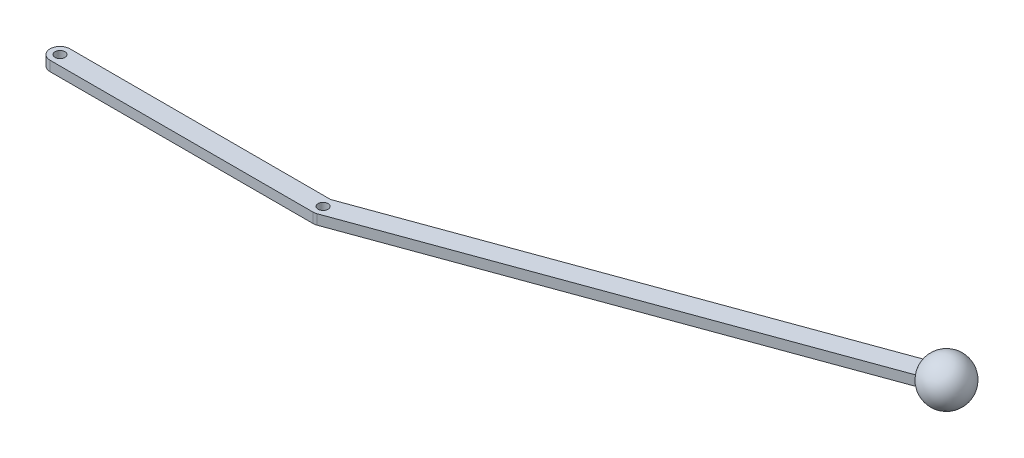
ISO-10303-21;
HEADER;
FILE_DESCRIPTION(('STEP AP214'),'2;1');
FILE_NAME('part.step','',(''),(''),'','','');
FILE_SCHEMA(('AUTOMOTIVE_DESIGN { 1 0 10303 214 1 1 1 1 }'));
ENDSEC;
DATA;
#1=APPLICATION_CONTEXT('core data for automotive mechanical design processes');
#2=APPLICATION_PROTOCOL_DEFINITION('international standard','automotive_design',2000,#1);
#3=PRODUCT_CONTEXT('',#1,'mechanical');
#4=PRODUCT('Part','Part','',(#3));
#5=PRODUCT_RELATED_PRODUCT_CATEGORY('part','',(#4));
#6=PRODUCT_DEFINITION_FORMATION('','',#4);
#7=PRODUCT_DEFINITION_CONTEXT('part definition',#1,'design');
#8=PRODUCT_DEFINITION('design','',#6,#7);
#9=PRODUCT_DEFINITION_SHAPE('','',#8);
#10=(LENGTH_UNIT() NAMED_UNIT(*) SI_UNIT(.MILLI.,.METRE.));
#11=(NAMED_UNIT(*) PLANE_ANGLE_UNIT() SI_UNIT($,.RADIAN.));
#12=(NAMED_UNIT(*) SI_UNIT($,.STERADIAN.) SOLID_ANGLE_UNIT());
#13=UNCERTAINTY_MEASURE_WITH_UNIT(LENGTH_MEASURE(1.E-05),#10,'distance_accuracy_value','');
#14=(GEOMETRIC_REPRESENTATION_CONTEXT(3) GLOBAL_UNCERTAINTY_ASSIGNED_CONTEXT((#13)) GLOBAL_UNIT_ASSIGNED_CONTEXT((#10,
#11,#12)) REPRESENTATION_CONTEXT('',''));
#15=CARTESIAN_POINT('',(0.,0.,0.));
#16=DIRECTION('',(0.,0.,1.));
#17=DIRECTION('',(1.,0.,0.));
#18=AXIS2_PLACEMENT_3D('',#15,#16,#17);
#19=CARTESIAN_POINT('',(0.,5.,0.));
#20=DIRECTION('',(0.,-1.,0.));
#21=DIRECTION('',(0.,0.,-1.));
#22=AXIS2_PLACEMENT_3D('',#19,#20,#21);
#23=CYLINDRICAL_SURFACE('',#22,10.);
#24=CARTESIAN_POINT('',(0.,-5.,0.));
#25=DIRECTION('',(0.,1.,0.));
#26=DIRECTION('',(0.,0.,1.));
#27=AXIS2_PLACEMENT_3D('',#24,#25,#26);
#28=CIRCLE('',#27,10.);
#29=CARTESIAN_POINT('',(3.42020143325664,-5.,9.39692620785914));
#30=VERTEX_POINT('',#29);
#31=CARTESIAN_POINT('',(1.45283093859922E-13,-5.,10.));
#32=VERTEX_POINT('',#31);
#33=EDGE_CURVE('E164',#30,#32,#28,.F.);
#34=ORIENTED_EDGE('',*,*,#33,.F.);
#35=DIRECTION('',(0.,-1.,0.));
#36=VECTOR('',#35,1.);
#37=CARTESIAN_POINT('',(3.42020143325664,5.,9.39692620785914));
#38=LINE('',#37,#36);
#39=CARTESIAN_POINT('',(3.42020143325664,5.,9.39692620785914));
#40=VERTEX_POINT('',#39);
#41=EDGE_CURVE('E48',#40,#30,#38,.T.);
#42=ORIENTED_EDGE('',*,*,#41,.F.);
#43=CARTESIAN_POINT('',(0.,5.,0.));
#44=DIRECTION('',(0.,1.,0.));
#45=DIRECTION('',(0.,0.,1.));
#46=AXIS2_PLACEMENT_3D('',#43,#44,#45);
#47=CIRCLE('',#46,10.);
#48=CARTESIAN_POINT('',(1.45283093859922E-13,5.,10.));
#49=VERTEX_POINT('',#48);
#50=EDGE_CURVE('E135',#40,#49,#47,.F.);
#51=ORIENTED_EDGE('',*,*,#50,.T.);
#52=DIRECTION('',(0.,-1.,0.));
#53=VECTOR('',#52,1.);
#54=CARTESIAN_POINT('',(1.45283093859922E-13,5.,10.));
#55=LINE('',#54,#53);
#56=EDGE_CURVE('E156',#49,#32,#55,.T.);
#57=ORIENTED_EDGE('',*,*,#56,.T.);
#58=EDGE_LOOP('',(#34,#42,#51,#57));
#59=FACE_BOUND('',#58,.T.);
#60=ADVANCED_FACE('F39',(#59),#23,.T.);
#61=CARTESIAN_POINT('',(3.42020143325671,5.,9.39692620785912));
#62=DIRECTION('',(0.34202014332567,0.,0.939692620785908));
#63=DIRECTION('',(0.939692620785908,0.,-0.34202014332567));
#64=AXIS2_PLACEMENT_3D('',#61,#62,#63);
#65=PLANE('',#64);
#66=DIRECTION('',(-0.939692620785908,0.,0.34202014332567));
#67=VECTOR('',#66,1.);
#68=CARTESIAN_POINT('',(3.42020143325671,-5.,9.39692620785912));
#69=LINE('',#68,#67);
#70=CARTESIAN_POINT('',(445.521500650989,-5.,-151.514787237812));
#71=VERTEX_POINT('',#70);
#72=EDGE_CURVE('E110',#71,#30,#69,.T.);
#73=ORIENTED_EDGE('',*,*,#72,.F.);
#74=CARTESIAN_POINT('',(463.869585618352,0.,-158.192944021719));
#75=DIRECTION('',(0.34202014332567,0.,0.939692620785908));
#76=DIRECTION('',(0.939692620785908,0.,-0.34202014332567));
#77=AXIS2_PLACEMENT_3D('',#74,#75,#76);
#78=CIRCLE('',#77,20.1556443707464);
#79=CARTESIAN_POINT('',(445.521500650989,5.,-151.514787237812));
#80=VERTEX_POINT('',#79);
#81=EDGE_CURVE('E63',#71,#80,#78,.F.);
#82=ORIENTED_EDGE('',*,*,#81,.T.);
#83=DIRECTION('',(-0.939692620785908,0.,0.34202014332567));
#84=VECTOR('',#83,1.);
#85=CARTESIAN_POINT('',(3.42020143325671,5.,9.39692620785912));
#86=LINE('',#85,#84);
#87=EDGE_CURVE('E139',#80,#40,#86,.T.);
#88=ORIENTED_EDGE('',*,*,#87,.T.);
#89=ORIENTED_EDGE('',*,*,#41,.T.);
#90=EDGE_LOOP('',(#73,#82,#88,#89));
#91=FACE_BOUND('',#90,.T.);
#92=ADVANCED_FACE('F192',(#91),#65,.T.);
#93=CARTESIAN_POINT('',(-3.42020143325664,5.,-9.39692620785891));
#94=DIRECTION('',(-0.34202014332567,0.,-0.939692620785908));
#95=DIRECTION('',(-0.939692620785908,0.,0.34202014332567));
#96=AXIS2_PLACEMENT_3D('',#93,#94,#95);
#97=PLANE('',#96);
#98=DIRECTION('',(0.939692620785908,0.,-0.34202014332567));
#99=VECTOR('',#98,1.);
#100=CARTESIAN_POINT('',(-3.42020143325664,5.,-9.39692620785891));
#101=LINE('',#100,#99);
#102=CARTESIAN_POINT('',(-2.2245441287731,5.,-9.83210987707389));
#103=VERTEX_POINT('',#102);
#104=CARTESIAN_POINT('',(438.681097784476,5.,-170.30863965353));
#105=VERTEX_POINT('',#104);
#106=EDGE_CURVE('E115',#103,#105,#101,.T.);
#107=ORIENTED_EDGE('',*,*,#106,.T.);
#108=CARTESIAN_POINT('',(457.029182751838,0.,-176.986796437437));
#109=DIRECTION('',(-0.34202014332567,0.,-0.939692620785908));
#110=DIRECTION('',(-0.939692620785908,0.,0.34202014332567));
#111=AXIS2_PLACEMENT_3D('',#108,#109,#110);
#112=CIRCLE('',#111,20.1556443707464);
#113=CARTESIAN_POINT('',(438.681097784476,-5.,-170.30863965353));
#114=VERTEX_POINT('',#113);
#115=EDGE_CURVE('E113',#105,#114,#112,.F.);
#116=ORIENTED_EDGE('',*,*,#115,.T.);
#117=DIRECTION('',(0.939692620785908,0.,-0.34202014332567));
#118=VECTOR('',#117,1.);
#119=CARTESIAN_POINT('',(-3.42020143325664,-5.,-9.39692620785891));
#120=LINE('',#119,#118);
#121=CARTESIAN_POINT('',(-2.2245441287731,-5.,-9.83210987707389));
#122=VERTEX_POINT('',#121);
#123=EDGE_CURVE('E101',#122,#114,#120,.T.);
#124=ORIENTED_EDGE('',*,*,#123,.F.);
#125=DIRECTION('',(0.,-1.,0.));
#126=VECTOR('',#125,1.);
#127=CARTESIAN_POINT('',(-2.2245441287731,5.,-9.83210987707389));
#128=LINE('',#127,#126);
#129=EDGE_CURVE('E186',#103,#122,#128,.T.);
#130=ORIENTED_EDGE('',*,*,#129,.F.);
#131=EDGE_LOOP('',(#107,#116,#124,#130));
#132=FACE_BOUND('',#131,.T.);
#133=ADVANCED_FACE('F114',(#132),#97,.T.);
#134=CARTESIAN_POINT('',(0.00628093227677194,5.,-9.8306845784573));
#135=DIRECTION('',(0.000638910845392721,0.,-0.999999795896445));
#136=DIRECTION('',(-0.999999795896445,0.,-0.000638910845392721));
#137=AXIS2_PLACEMENT_3D('',#134,#135,#136);
#138=PLANE('',#137);
#139=DIRECTION('',(0.999999795896445,0.,0.000638910845392721));
#140=VECTOR('',#139,1.);
#141=CARTESIAN_POINT('',(0.00628093227677194,-5.,-9.8306845784573));
#142=LINE('',#141,#140);
#143=CARTESIAN_POINT('',(-265.,-5.,-10.));
#144=VERTEX_POINT('',#143);
#145=EDGE_CURVE('E107',#144,#122,#142,.T.);
#146=ORIENTED_EDGE('',*,*,#145,.F.);
#147=DIRECTION('',(0.,-1.,0.));
#148=VECTOR('',#147,1.);
#149=CARTESIAN_POINT('',(-265.,5.,-10.));
#150=LINE('',#149,#148);
#151=CARTESIAN_POINT('',(-265.,5.,-10.));
#152=VERTEX_POINT('',#151);
#153=EDGE_CURVE('E183',#152,#144,#150,.T.);
#154=ORIENTED_EDGE('',*,*,#153,.F.);
#155=DIRECTION('',(0.999999795896445,0.,0.000638910845392721));
#156=VECTOR('',#155,1.);
#157=CARTESIAN_POINT('',(0.00628093227677194,5.,-9.8306845784573));
#158=LINE('',#157,#156);
#159=EDGE_CURVE('E144',#152,#103,#158,.T.);
#160=ORIENTED_EDGE('',*,*,#159,.T.);
#161=ORIENTED_EDGE('',*,*,#129,.T.);
#162=EDGE_LOOP('',(#146,#154,#160,#161));
#163=FACE_BOUND('',#162,.T.);
#164=ADVANCED_FACE('F205',(#163),#138,.T.);
#165=CARTESIAN_POINT('',(-265.,5.,0.));
#166=DIRECTION('',(0.,-1.,0.));
#167=DIRECTION('',(0.,0.,-1.));
#168=AXIS2_PLACEMENT_3D('',#165,#166,#167);
#169=CYLINDRICAL_SURFACE('',#168,10.);
#170=CARTESIAN_POINT('',(-265.,-5.,0.));
#171=DIRECTION('',(0.,1.,0.));
#172=DIRECTION('',(0.,0.,1.));
#173=AXIS2_PLACEMENT_3D('',#170,#171,#172);
#174=CIRCLE('',#173,10.);
#175=CARTESIAN_POINT('',(-265.,-5.,10.));
#176=VERTEX_POINT('',#175);
#177=EDGE_CURVE('E172',#176,#144,#174,.F.);
#178=ORIENTED_EDGE('',*,*,#177,.F.);
#179=DIRECTION('',(0.,-1.,0.));
#180=VECTOR('',#179,1.);
#181=CARTESIAN_POINT('',(-265.,5.,10.));
#182=LINE('',#181,#180);
#183=CARTESIAN_POINT('',(-265.,5.,10.));
#184=VERTEX_POINT('',#183);
#185=EDGE_CURVE('E180',#184,#176,#182,.T.);
#186=ORIENTED_EDGE('',*,*,#185,.F.);
#187=CARTESIAN_POINT('',(-265.,5.,0.));
#188=DIRECTION('',(0.,1.,0.));
#189=DIRECTION('',(0.,0.,1.));
#190=AXIS2_PLACEMENT_3D('',#187,#188,#189);
#191=CIRCLE('',#190,10.);
#192=EDGE_CURVE('E148',#184,#152,#191,.F.);
#193=ORIENTED_EDGE('',*,*,#192,.T.);
#194=ORIENTED_EDGE('',*,*,#153,.T.);
#195=EDGE_LOOP('',(#178,#186,#193,#194));
#196=FACE_BOUND('',#195,.T.);
#197=ADVANCED_FACE('F202',(#196),#169,.T.);
#198=CARTESIAN_POINT('',(-265.,5.,0.));
#199=DIRECTION('',(0.,-1.,0.));
#200=DIRECTION('',(0.,0.,-1.));
#201=AXIS2_PLACEMENT_3D('',#198,#199,#200);
#202=CYLINDRICAL_SURFACE('',#201,4.99999999999999);
#203=CARTESIAN_POINT('',(-265.,5.,0.));
#204=DIRECTION('',(0.,1.,0.));
#205=DIRECTION('',(0.,0.,1.));
#206=AXIS2_PLACEMENT_3D('',#203,#204,#205);
#207=CIRCLE('',#206,4.99999999999999);
#208=CARTESIAN_POINT('',(-265.,5.,4.99999999999999));
#209=VERTEX_POINT('',#208);
#210=EDGE_CURVE('E130',#209,#209,#207,.T.);
#211=ORIENTED_EDGE('',*,*,#210,.T.);
#212=EDGE_LOOP('',(#211));
#213=FACE_BOUND('',#212,.T.);
#214=CARTESIAN_POINT('',(-265.,-5.,0.));
#215=DIRECTION('',(0.,1.,0.));
#216=DIRECTION('',(0.,0.,1.));
#217=AXIS2_PLACEMENT_3D('',#214,#215,#216);
#218=CIRCLE('',#217,4.99999999999999);
#219=CARTESIAN_POINT('',(-265.,-5.,4.99999999999999));
#220=VERTEX_POINT('',#219);
#221=EDGE_CURVE('E160',#220,#220,#218,.T.);
#222=ORIENTED_EDGE('',*,*,#221,.F.);
#223=EDGE_LOOP('',(#222));
#224=FACE_BOUND('',#223,.T.);
#225=ADVANCED_FACE('F228',(#213,#224),#202,.F.);
#226=CARTESIAN_POINT('',(0.,5.,0.));
#227=DIRECTION('',(0.,-1.,0.));
#228=DIRECTION('',(0.,0.,-1.));
#229=AXIS2_PLACEMENT_3D('',#226,#227,#228);
#230=CYLINDRICAL_SURFACE('',#229,5.);
#231=CARTESIAN_POINT('',(0.,5.,0.));
#232=DIRECTION('',(0.,1.,0.));
#233=DIRECTION('',(0.,0.,1.));
#234=AXIS2_PLACEMENT_3D('',#231,#232,#233);
#235=CIRCLE('',#234,5.);
#236=CARTESIAN_POINT('',(0.,5.,5.));
#237=VERTEX_POINT('',#236);
#238=EDGE_CURVE('E126',#237,#237,#235,.T.);
#239=ORIENTED_EDGE('',*,*,#238,.T.);
#240=EDGE_LOOP('',(#239));
#241=FACE_BOUND('',#240,.T.);
#242=CARTESIAN_POINT('',(0.,-5.,0.));
#243=DIRECTION('',(0.,1.,0.));
#244=DIRECTION('',(0.,0.,1.));
#245=AXIS2_PLACEMENT_3D('',#242,#243,#244);
#246=CIRCLE('',#245,5.);
#247=CARTESIAN_POINT('',(0.,-5.,5.));
#248=VERTEX_POINT('',#247);
#249=EDGE_CURVE('E123',#248,#248,#246,.T.);
#250=ORIENTED_EDGE('',*,*,#249,.F.);
#251=EDGE_LOOP('',(#250));
#252=FACE_BOUND('',#251,.T.);
#253=ADVANCED_FACE('F41',(#241,#252),#230,.F.);
#254=CARTESIAN_POINT('',(0.,5.,10.));
#255=DIRECTION('',(0.,0.,1.));
#256=DIRECTION('',(1.,0.,0.));
#257=AXIS2_PLACEMENT_3D('',#254,#255,#256);
#258=PLANE('',#257);
#259=DIRECTION('',(-1.,0.,0.));
#260=VECTOR('',#259,1.);
#261=CARTESIAN_POINT('',(0.,-5.,10.));
#262=LINE('',#261,#260);
#263=EDGE_CURVE('E131',#32,#176,#262,.T.);
#264=ORIENTED_EDGE('',*,*,#263,.F.);
#265=ORIENTED_EDGE('',*,*,#56,.F.);
#266=DIRECTION('',(-1.,0.,0.));
#267=VECTOR('',#266,1.);
#268=CARTESIAN_POINT('',(0.,5.,10.));
#269=LINE('',#268,#267);
#270=EDGE_CURVE('E152',#49,#184,#269,.T.);
#271=ORIENTED_EDGE('',*,*,#270,.T.);
#272=ORIENTED_EDGE('',*,*,#185,.T.);
#273=EDGE_LOOP('',(#264,#265,#271,#272));
#274=FACE_BOUND('',#273,.T.);
#275=ADVANCED_FACE('F197',(#274),#258,.T.);
#276=CARTESIAN_POINT('',(0.,5.,0.));
#277=DIRECTION('',(0.,1.,0.));
#278=DIRECTION('',(0.,0.,1.));
#279=AXIS2_PLACEMENT_3D('',#276,#277,#278);
#280=PLANE('',#279);
#281=ORIENTED_EDGE('',*,*,#238,.F.);
#282=EDGE_LOOP('',(#281));
#283=FACE_BOUND('',#282,.T.);
#284=ORIENTED_EDGE('',*,*,#210,.F.);
#285=EDGE_LOOP('',(#284));
#286=FACE_BOUND('',#285,.T.);
#287=ORIENTED_EDGE('',*,*,#87,.F.);
#288=CARTESIAN_POINT('',(460.449384185095,5.,-167.589870229578));
#289=DIRECTION('',(0.,1.,0.));
#290=DIRECTION('',(0.,0.,1.));
#291=AXIS2_PLACEMENT_3D('',#288,#289,#290);
#292=CIRCLE('',#291,21.9374109684803);
#293=EDGE_CURVE('E55',#80,#105,#292,.F.);
#294=ORIENTED_EDGE('',*,*,#293,.T.);
#295=ORIENTED_EDGE('',*,*,#106,.F.);
#296=ORIENTED_EDGE('',*,*,#159,.F.);
#297=ORIENTED_EDGE('',*,*,#192,.F.);
#298=ORIENTED_EDGE('',*,*,#270,.F.);
#299=ORIENTED_EDGE('',*,*,#50,.F.);
#300=EDGE_LOOP('',(#287,#294,#295,#296,#297,#298,#299));
#301=FACE_BOUND('',#300,.T.);
#302=ADVANCED_FACE('F206',(#283,#286,#301),#280,.T.);
#303=CARTESIAN_POINT('',(0.,-5.,0.));
#304=DIRECTION('',(0.,1.,0.));
#305=DIRECTION('',(0.,0.,1.));
#306=AXIS2_PLACEMENT_3D('',#303,#304,#305);
#307=PLANE('',#306);
#308=CARTESIAN_POINT('',(460.449384185095,-5.,-167.589870229578));
#309=DIRECTION('',(0.,1.,0.));
#310=DIRECTION('',(0.,0.,1.));
#311=AXIS2_PLACEMENT_3D('',#308,#309,#310);
#312=CIRCLE('',#311,21.9374109684803);
#313=EDGE_CURVE('E11',#71,#114,#312,.F.);
#314=ORIENTED_EDGE('',*,*,#313,.F.);
#315=ORIENTED_EDGE('',*,*,#72,.T.);
#316=ORIENTED_EDGE('',*,*,#33,.T.);
#317=ORIENTED_EDGE('',*,*,#263,.T.);
#318=ORIENTED_EDGE('',*,*,#177,.T.);
#319=ORIENTED_EDGE('',*,*,#145,.T.);
#320=ORIENTED_EDGE('',*,*,#123,.T.);
#321=EDGE_LOOP('',(#314,#315,#316,#317,#318,#319,#320));
#322=FACE_BOUND('',#321,.T.);
#323=ORIENTED_EDGE('',*,*,#249,.T.);
#324=EDGE_LOOP('',(#323));
#325=FACE_BOUND('',#324,.T.);
#326=ORIENTED_EDGE('',*,*,#221,.T.);
#327=EDGE_LOOP('',(#326));
#328=FACE_BOUND('',#327,.T.);
#329=ADVANCED_FACE('F103',(#322,#325,#328),#307,.F.);
#330=CARTESIAN_POINT('',(460.449384185095,0.,-167.589870229578));
#331=DIRECTION('',(-0.300301273410763,0.,-0.953844403028017));
#332=DIRECTION('',(0.953844403028017,0.,-0.300301273410763));
#333=AXIS2_PLACEMENT_3D('',#330,#331,#332);
#334=SPHERICAL_SURFACE('',#333,22.5);
#335=ORIENTED_EDGE('',*,*,#293,.F.);
#336=ORIENTED_EDGE('',*,*,#81,.F.);
#337=ORIENTED_EDGE('',*,*,#313,.T.);
#338=ORIENTED_EDGE('',*,*,#115,.F.);
#339=EDGE_LOOP('',(#335,#336,#337,#338));
#340=FACE_BOUND('',#339,.T.);
#341=ADVANCED_FACE('F119',(#340),#334,.T.);
#342=CLOSED_SHELL('',(#60,#92,#133,#164,#197,#225,#253,#275,#302,#329,#341));
#343=MANIFOLD_SOLID_BREP('B2',#342);
#344=ADVANCED_BREP_SHAPE_REPRESENTATION('',(#18,#343),#14);
#345=SHAPE_DEFINITION_REPRESENTATION(#9,#344);
ENDSEC;
END-ISO-10303-21;
